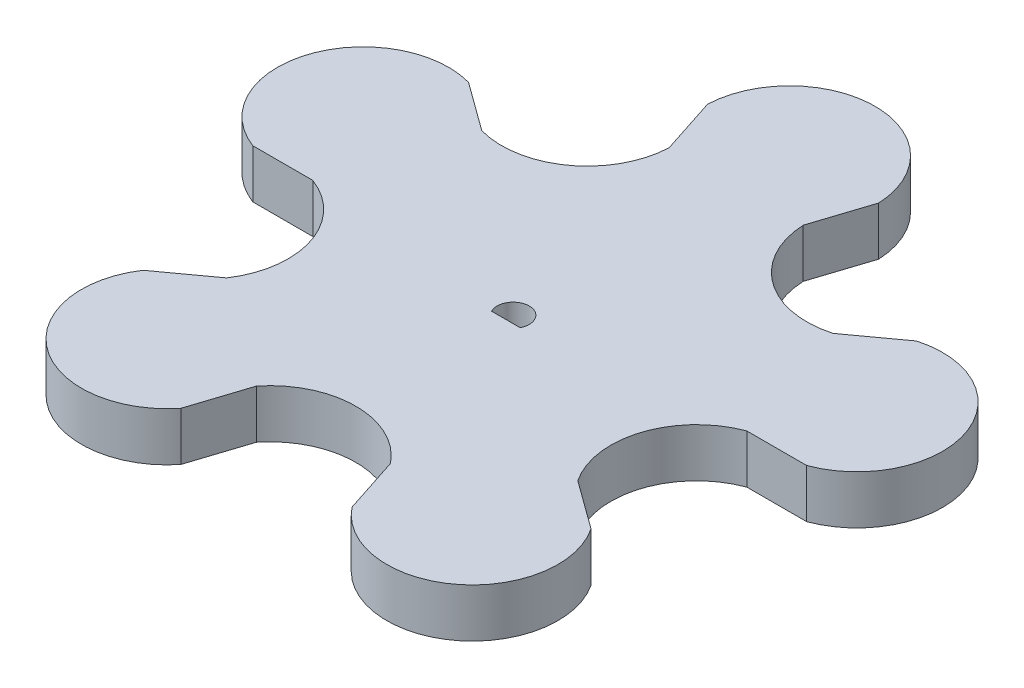
ISO-10303-21;
HEADER;
FILE_DESCRIPTION(('STEP AP214'),'2;1');
FILE_NAME('part.step','',(''),(''),'','','');
FILE_SCHEMA(('AUTOMOTIVE_DESIGN { 1 0 10303 214 1 1 1 1 }'));
ENDSEC;
DATA;
#1=APPLICATION_CONTEXT('core data for automotive mechanical design processes');
#2=APPLICATION_PROTOCOL_DEFINITION('international standard','automotive_design',2000,#1);
#3=PRODUCT_CONTEXT('',#1,'mechanical');
#4=PRODUCT('Part','Part','',(#3));
#5=PRODUCT_RELATED_PRODUCT_CATEGORY('part','',(#4));
#6=PRODUCT_DEFINITION_FORMATION('','',#4);
#7=PRODUCT_DEFINITION_CONTEXT('part definition',#1,'design');
#8=PRODUCT_DEFINITION('design','',#6,#7);
#9=PRODUCT_DEFINITION_SHAPE('','',#8);
#10=(LENGTH_UNIT() NAMED_UNIT(*) SI_UNIT(.MILLI.,.METRE.));
#11=(NAMED_UNIT(*) PLANE_ANGLE_UNIT() SI_UNIT($,.RADIAN.));
#12=(NAMED_UNIT(*) SI_UNIT($,.STERADIAN.) SOLID_ANGLE_UNIT());
#13=UNCERTAINTY_MEASURE_WITH_UNIT(LENGTH_MEASURE(1.E-05),#10,'distance_accuracy_value','');
#14=(GEOMETRIC_REPRESENTATION_CONTEXT(3) GLOBAL_UNCERTAINTY_ASSIGNED_CONTEXT((#13)) GLOBAL_UNIT_ASSIGNED_CONTEXT((#10,
#11,#12)) REPRESENTATION_CONTEXT('',''));
#15=CARTESIAN_POINT('',(0.,0.,0.));
#16=DIRECTION('',(0.,0.,1.));
#17=DIRECTION('',(1.,0.,0.));
#18=AXIS2_PLACEMENT_3D('',#15,#16,#17);
#19=CARTESIAN_POINT('',(9.9581401872886,3.175,-30.6480041153014));
#20=DIRECTION('',(0.,-1.,0.));
#21=DIRECTION('',(0.,0.,-1.));
#22=AXIS2_PLACEMENT_3D('',#19,#20,#21);
#23=CYLINDRICAL_SURFACE('',#22,5.58800000000008);
#24=CARTESIAN_POINT('',(9.9581401872886,0.,-30.6480041153014));
#25=DIRECTION('',(0.,1.,0.));
#26=DIRECTION('',(0.,0.,1.));
#27=AXIS2_PLACEMENT_3D('',#24,#25,#26);
#28=CIRCLE('',#27,5.58800000000008);
#29=CARTESIAN_POINT('',(4.37531265995944,0.,-30.4076277435516));
#30=VERTEX_POINT('',#29);
#31=CARTESIAN_POINT('',(11.4547172551814,0.,-25.264139232166));
#32=VERTEX_POINT('',#31);
#33=EDGE_CURVE('E197',#30,#32,#28,.T.);
#34=ORIENTED_EDGE('',*,*,#33,.F.);
#35=DIRECTION('',(0.,-1.,0.));
#36=VECTOR('',#35,1.);
#37=CARTESIAN_POINT('',(4.37531265995944,3.175,-30.4076277435516));
#38=LINE('',#37,#36);
#39=CARTESIAN_POINT('',(4.37531265995944,3.175,-30.4076277435516));
#40=VERTEX_POINT('',#39);
#41=EDGE_CURVE('E11',#40,#30,#38,.T.);
#42=ORIENTED_EDGE('',*,*,#41,.F.);
#43=CARTESIAN_POINT('',(9.9581401872886,3.175,-30.6480041153014));
#44=DIRECTION('',(0.,1.,0.));
#45=DIRECTION('',(0.,0.,1.));
#46=AXIS2_PLACEMENT_3D('',#43,#44,#45);
#47=CIRCLE('',#46,5.58800000000008);
#48=CARTESIAN_POINT('',(11.4547172551814,3.175,-25.264139232166));
#49=VERTEX_POINT('',#48);
#50=EDGE_CURVE('E199',#40,#49,#47,.T.);
#51=ORIENTED_EDGE('',*,*,#50,.T.);
#52=DIRECTION('',(0.,-1.,0.));
#53=VECTOR('',#52,1.);
#54=CARTESIAN_POINT('',(11.4547172551814,3.175,-25.264139232166));
#55=LINE('',#54,#53);
#56=EDGE_CURVE('E250',#49,#32,#55,.T.);
#57=ORIENTED_EDGE('',*,*,#56,.T.);
#58=EDGE_LOOP('',(#34,#42,#51,#57));
#59=FACE_BOUND('',#58,.T.);
#60=ADVANCED_FACE('F34',(#59),#23,.F.);
#61=CARTESIAN_POINT('',(-4.97907009364429,3.175,-1.61779794234925));
#62=DIRECTION('',(0.951056516295154,0.,0.309016994374947));
#63=DIRECTION('',(0.309016994374947,0.,-0.951056516295154));
#64=AXIS2_PLACEMENT_3D('',#61,#62,#63);
#65=PLANE('',#64);
#66=DIRECTION('',(-0.309016994374947,0.,0.951056516295154));
#67=VECTOR('',#66,1.);
#68=CARTESIAN_POINT('',(-4.97907009364429,0.,-1.61779794234925));
#69=LINE('',#68,#67);
#70=CARTESIAN_POINT('',(5.58282752732916,0.,-34.1239763717498));
#71=VERTEX_POINT('',#70);
#72=EDGE_CURVE('E253',#71,#30,#69,.T.);
#73=ORIENTED_EDGE('',*,*,#72,.F.);
#74=DIRECTION('',(0.,-1.,0.));
#75=VECTOR('',#74,1.);
#76=CARTESIAN_POINT('',(5.58282752732916,3.175,-34.1239763717498));
#77=LINE('',#76,#75);
#78=CARTESIAN_POINT('',(5.58282752732916,3.175,-34.1239763717498));
#79=VERTEX_POINT('',#78);
#80=EDGE_CURVE('E41',#79,#71,#77,.T.);
#81=ORIENTED_EDGE('',*,*,#80,.F.);
#82=DIRECTION('',(-0.309016994374947,0.,0.951056516295154));
#83=VECTOR('',#82,1.);
#84=CARTESIAN_POINT('',(-4.97907009364429,3.175,-1.61779794234925));
#85=LINE('',#84,#83);
#86=EDGE_CURVE('E202',#79,#40,#85,.T.);
#87=ORIENTED_EDGE('',*,*,#86,.T.);
#88=ORIENTED_EDGE('',*,*,#41,.T.);
#89=EDGE_LOOP('',(#73,#81,#87,#88));
#90=FACE_BOUND('',#89,.T.);
#91=ADVANCED_FACE('F352',(#90),#65,.T.);
#92=CARTESIAN_POINT('',(0.,3.175,-33.8836000000023));
#93=DIRECTION('',(0.,-1.,0.));
#94=DIRECTION('',(0.,0.,-1.));
#95=AXIS2_PLACEMENT_3D('',#92,#93,#94);
#96=CYLINDRICAL_SURFACE('',#95,5.58799999999983);
#97=CARTESIAN_POINT('',(0.,0.,-33.8836000000023));
#98=DIRECTION('',(0.,1.,0.));
#99=DIRECTION('',(0.,0.,1.));
#100=AXIS2_PLACEMENT_3D('',#97,#98,#99);
#101=CIRCLE('',#100,5.58799999999983);
#102=CARTESIAN_POINT('',(-5.58282752732906,0.,-34.1239763717498));
#103=VERTEX_POINT('',#102);
#104=EDGE_CURVE('E256',#71,#103,#101,.T.);
#105=ORIENTED_EDGE('',*,*,#104,.T.);
#106=DIRECTION('',(0.,-1.,0.));
#107=VECTOR('',#106,1.);
#108=CARTESIAN_POINT('',(-5.58282752732906,3.175,-34.1239763717498));
#109=LINE('',#108,#107);
#110=CARTESIAN_POINT('',(-5.58282752732906,3.175,-34.1239763717498));
#111=VERTEX_POINT('',#110);
#112=EDGE_CURVE('E341',#111,#103,#109,.T.);
#113=ORIENTED_EDGE('',*,*,#112,.F.);
#114=CARTESIAN_POINT('',(0.,3.175,-33.8836000000023));
#115=DIRECTION('',(0.,1.,0.));
#116=DIRECTION('',(0.,0.,1.));
#117=AXIS2_PLACEMENT_3D('',#114,#115,#116);
#118=CIRCLE('',#117,5.58799999999983);
#119=EDGE_CURVE('E206',#79,#111,#118,.T.);
#120=ORIENTED_EDGE('',*,*,#119,.F.);
#121=ORIENTED_EDGE('',*,*,#80,.T.);
#122=EDGE_LOOP('',(#105,#113,#120,#121));
#123=FACE_BOUND('',#122,.T.);
#124=ADVANCED_FACE('F346',(#123),#96,.T.);
#125=CARTESIAN_POINT('',(4.97907009364423,3.175,-1.6177979423492));
#126=DIRECTION('',(0.951056516295155,0.,-0.309016994374941));
#127=DIRECTION('',(-0.309016994374942,0.,-0.951056516295156));
#128=AXIS2_PLACEMENT_3D('',#125,#126,#127);
#129=PLANE('',#128);
#130=DIRECTION('',(0.309016994374942,0.,0.951056516295156));
#131=VECTOR('',#130,1.);
#132=CARTESIAN_POINT('',(4.97907009364423,0.,-1.6177979423492));
#133=LINE('',#132,#131);
#134=CARTESIAN_POINT('',(-4.37531265995936,0.,-30.4076277435517));
#135=VERTEX_POINT('',#134);
#136=EDGE_CURVE('E258',#103,#135,#133,.T.);
#137=ORIENTED_EDGE('',*,*,#136,.T.);
#138=DIRECTION('',(0.,-1.,0.));
#139=VECTOR('',#138,1.);
#140=CARTESIAN_POINT('',(-4.37531265995936,3.175,-30.4076277435517));
#141=LINE('',#140,#139);
#142=CARTESIAN_POINT('',(-4.37531265995936,3.175,-30.4076277435517));
#143=VERTEX_POINT('',#142);
#144=EDGE_CURVE('E339',#143,#135,#141,.T.);
#145=ORIENTED_EDGE('',*,*,#144,.F.);
#146=DIRECTION('',(0.309016994374942,0.,0.951056516295156));
#147=VECTOR('',#146,1.);
#148=CARTESIAN_POINT('',(4.97907009364423,3.175,-1.6177979423492));
#149=LINE('',#148,#147);
#150=EDGE_CURVE('E208',#111,#143,#149,.T.);
#151=ORIENTED_EDGE('',*,*,#150,.F.);
#152=ORIENTED_EDGE('',*,*,#112,.T.);
#153=EDGE_LOOP('',(#137,#145,#151,#152));
#154=FACE_BOUND('',#153,.T.);
#155=ADVANCED_FACE('F431',(#154),#129,.F.);
#156=CARTESIAN_POINT('',(-9.95814018728854,3.175,-30.6480041153015));
#157=DIRECTION('',(0.,-1.,0.));
#158=DIRECTION('',(0.,0.,-1.));
#159=AXIS2_PLACEMENT_3D('',#156,#157,#158);
#160=CYLINDRICAL_SURFACE('',#159,5.58800000000005);
#161=CARTESIAN_POINT('',(-9.95814018728854,0.,-30.6480041153015));
#162=DIRECTION('',(0.,1.,0.));
#163=DIRECTION('',(0.,0.,1.));
#164=AXIS2_PLACEMENT_3D('',#161,#162,#163);
#165=CIRCLE('',#164,5.58800000000005);
#166=CARTESIAN_POINT('',(-11.4547172551815,0.,-25.2641392321662));
#167=VERTEX_POINT('',#166);
#168=EDGE_CURVE('E261',#167,#135,#165,.T.);
#169=ORIENTED_EDGE('',*,*,#168,.F.);
#170=DIRECTION('',(0.,-1.,0.));
#171=VECTOR('',#170,1.);
#172=CARTESIAN_POINT('',(-11.4547172551815,3.175,-25.2641392321662));
#173=LINE('',#172,#171);
#174=CARTESIAN_POINT('',(-11.4547172551815,3.175,-25.2641392321662));
#175=VERTEX_POINT('',#174);
#176=EDGE_CURVE('E337',#175,#167,#173,.T.);
#177=ORIENTED_EDGE('',*,*,#176,.F.);
#178=CARTESIAN_POINT('',(-9.95814018728854,3.175,-30.6480041153015));
#179=DIRECTION('',(0.,1.,0.));
#180=DIRECTION('',(0.,0.,1.));
#181=AXIS2_PLACEMENT_3D('',#178,#179,#180);
#182=CIRCLE('',#181,5.58800000000005);
#183=EDGE_CURVE('E210',#175,#143,#182,.T.);
#184=ORIENTED_EDGE('',*,*,#183,.T.);
#185=ORIENTED_EDGE('',*,*,#144,.T.);
#186=EDGE_LOOP('',(#169,#177,#184,#185));
#187=FACE_BOUND('',#186,.T.);
#188=ADVANCED_FACE('F427',(#187),#160,.F.);
#189=CARTESIAN_POINT('',(8.0563046438846,3.175,-11.0885520576507));
#190=DIRECTION('',(0.587785252292473,0.,-0.809016994374947));
#191=DIRECTION('',(-0.809016994374948,0.,-0.587785252292473));
#192=AXIS2_PLACEMENT_3D('',#189,#190,#191);
#193=PLANE('',#192);
#194=DIRECTION('',(0.809016994374948,0.,0.587785252292473));
#195=VECTOR('',#194,1.);
#196=CARTESIAN_POINT('',(8.0563046438846,0.,-11.0885520576507));
#197=LINE('',#196,#195);
#198=CARTESIAN_POINT('',(-14.6160322198763,0.,-27.5609689984367));
#199=VERTEX_POINT('',#198);
#200=EDGE_CURVE('E264',#199,#167,#197,.T.);
#201=ORIENTED_EDGE('',*,*,#200,.F.);
#202=DIRECTION('',(0.,-1.,0.));
#203=VECTOR('',#202,1.);
#204=CARTESIAN_POINT('',(-14.6160322198763,3.175,-27.5609689984367));
#205=LINE('',#204,#203);
#206=CARTESIAN_POINT('',(-14.6160322198763,3.175,-27.5609689984367));
#207=VERTEX_POINT('',#206);
#208=EDGE_CURVE('E335',#207,#199,#205,.T.);
#209=ORIENTED_EDGE('',*,*,#208,.F.);
#210=DIRECTION('',(0.809016994374948,0.,0.587785252292473));
#211=VECTOR('',#210,1.);
#212=CARTESIAN_POINT('',(8.0563046438846,3.175,-11.0885520576507));
#213=LINE('',#212,#211);
#214=EDGE_CURVE('E213',#207,#175,#213,.T.);
#215=ORIENTED_EDGE('',*,*,#214,.T.);
#216=ORIENTED_EDGE('',*,*,#176,.T.);
#217=EDGE_LOOP('',(#201,#209,#215,#216));
#218=FACE_BOUND('',#217,.T.);
#219=ADVANCED_FACE('F423',(#218),#193,.T.);
#220=CARTESIAN_POINT('',(-16.1126092877692,3.175,-22.1771041153015));
#221=DIRECTION('',(0.,-1.,0.));
#222=DIRECTION('',(0.,0.,-1.));
#223=AXIS2_PLACEMENT_3D('',#220,#221,#222);
#224=CYLINDRICAL_SURFACE('',#223,5.58799999999998);
#225=CARTESIAN_POINT('',(-16.1126092877692,0.,-22.1771041153015));
#226=DIRECTION('',(0.,1.,0.));
#227=DIRECTION('',(0.,0.,1.));
#228=AXIS2_PLACEMENT_3D('',#225,#226,#227);
#229=CIRCLE('',#228,5.58799999999998);
#230=CARTESIAN_POINT('',(-18.0664093850942,0.,-16.9418));
#231=VERTEX_POINT('',#230);
#232=EDGE_CURVE('E267',#199,#231,#229,.T.);
#233=ORIENTED_EDGE('',*,*,#232,.T.);
#234=DIRECTION('',(0.,-1.,0.));
#235=VECTOR('',#234,1.);
#236=CARTESIAN_POINT('',(-18.0664093850942,3.175,-16.9418));
#237=LINE('',#236,#235);
#238=CARTESIAN_POINT('',(-18.0664093850942,3.175,-16.9418));
#239=VERTEX_POINT('',#238);
#240=EDGE_CURVE('E332',#239,#231,#237,.T.);
#241=ORIENTED_EDGE('',*,*,#240,.F.);
#242=CARTESIAN_POINT('',(-16.1126092877692,3.175,-22.1771041153015));
#243=DIRECTION('',(0.,1.,0.));
#244=DIRECTION('',(0.,0.,1.));
#245=AXIS2_PLACEMENT_3D('',#242,#243,#244);
#246=CIRCLE('',#245,5.58799999999998);
#247=EDGE_CURVE('E216',#207,#239,#246,.T.);
#248=ORIENTED_EDGE('',*,*,#247,.F.);
#249=ORIENTED_EDGE('',*,*,#208,.T.);
#250=EDGE_LOOP('',(#233,#241,#248,#249));
#251=FACE_BOUND('',#250,.T.);
#252=ADVANCED_FACE('F419',(#251),#224,.T.);
#253=CARTESIAN_POINT('',(0.,3.175,-16.9418));
#254=DIRECTION('',(0.,0.,-1.));
#255=DIRECTION('',(-1.,0.,0.));
#256=AXIS2_PLACEMENT_3D('',#253,#254,#255);
#257=PLANE('',#256);
#258=DIRECTION('',(1.,0.,0.));
#259=VECTOR('',#258,1.);
#260=CARTESIAN_POINT('',(0.,0.,-16.9418));
#261=LINE('',#260,#259);
#262=CARTESIAN_POINT('',(-14.1588091904442,0.,-16.9418));
#263=VERTEX_POINT('',#262);
#264=EDGE_CURVE('E269',#231,#263,#261,.T.);
#265=ORIENTED_EDGE('',*,*,#264,.T.);
#266=DIRECTION('',(0.,-1.,0.));
#267=VECTOR('',#266,1.);
#268=CARTESIAN_POINT('',(-14.1588091904442,3.175,-16.9418));
#269=LINE('',#268,#267);
#270=CARTESIAN_POINT('',(-14.1588091904442,3.175,-16.9418));
#271=VERTEX_POINT('',#270);
#272=EDGE_CURVE('E330',#271,#263,#269,.T.);
#273=ORIENTED_EDGE('',*,*,#272,.F.);
#274=DIRECTION('',(1.,0.,0.));
#275=VECTOR('',#274,1.);
#276=CARTESIAN_POINT('',(0.,3.175,-16.9418));
#277=LINE('',#276,#275);
#278=EDGE_CURVE('E218',#239,#271,#277,.T.);
#279=ORIENTED_EDGE('',*,*,#278,.F.);
#280=ORIENTED_EDGE('',*,*,#240,.T.);
#281=EDGE_LOOP('',(#265,#273,#279,#280));
#282=FACE_BOUND('',#281,.T.);
#283=ADVANCED_FACE('F415',(#282),#257,.F.);
#284=CARTESIAN_POINT('',(-16.1126092877692,3.175,-11.7064958846985));
#285=DIRECTION('',(0.,-1.,0.));
#286=DIRECTION('',(0.,0.,-1.));
#287=AXIS2_PLACEMENT_3D('',#284,#285,#286);
#288=CYLINDRICAL_SURFACE('',#287,5.58799999999999);
#289=CARTESIAN_POINT('',(-16.1126092877692,0.,-11.7064958846985));
#290=DIRECTION('',(0.,1.,0.));
#291=DIRECTION('',(0.,0.,1.));
#292=AXIS2_PLACEMENT_3D('',#289,#290,#291);
#293=CIRCLE('',#292,5.58799999999999);
#294=CARTESIAN_POINT('',(-11.4547172551815,0.,-8.61946076783375));
#295=VERTEX_POINT('',#294);
#296=EDGE_CURVE('E272',#295,#263,#293,.T.);
#297=ORIENTED_EDGE('',*,*,#296,.F.);
#298=DIRECTION('',(0.,-1.,0.));
#299=VECTOR('',#298,1.);
#300=CARTESIAN_POINT('',(-11.4547172551815,3.175,-8.61946076783375));
#301=LINE('',#300,#299);
#302=CARTESIAN_POINT('',(-11.4547172551815,3.175,-8.61946076783375));
#303=VERTEX_POINT('',#302);
#304=EDGE_CURVE('E328',#303,#295,#301,.T.);
#305=ORIENTED_EDGE('',*,*,#304,.F.);
#306=CARTESIAN_POINT('',(-16.1126092877692,3.175,-11.7064958846985));
#307=DIRECTION('',(0.,1.,0.));
#308=DIRECTION('',(0.,0.,1.));
#309=AXIS2_PLACEMENT_3D('',#306,#307,#308);
#310=CIRCLE('',#309,5.58799999999999);
#311=EDGE_CURVE('E220',#303,#271,#310,.T.);
#312=ORIENTED_EDGE('',*,*,#311,.T.);
#313=ORIENTED_EDGE('',*,*,#272,.T.);
#314=EDGE_LOOP('',(#297,#305,#312,#313));
#315=FACE_BOUND('',#314,.T.);
#316=ADVANCED_FACE('F410',(#315),#288,.F.);
#317=CARTESIAN_POINT('',(-8.05630464388455,3.175,-11.0885520576507));
#318=DIRECTION('',(-0.587785252292471,0.,-0.809016994374949));
#319=DIRECTION('',(-0.809016994374949,0.,0.587785252292471));
#320=AXIS2_PLACEMENT_3D('',#317,#318,#319);
#321=PLANE('',#320);
#322=DIRECTION('',(0.809016994374949,0.,-0.587785252292471));
#323=VECTOR('',#322,1.);
#324=CARTESIAN_POINT('',(-8.05630464388455,0.,-11.0885520576507));
#325=LINE('',#324,#323);
#326=CARTESIAN_POINT('',(-14.6160322198763,0.,-6.32263100156325));
#327=VERTEX_POINT('',#326);
#328=EDGE_CURVE('E275',#327,#295,#325,.T.);
#329=ORIENTED_EDGE('',*,*,#328,.F.);
#330=DIRECTION('',(0.,-1.,0.));
#331=VECTOR('',#330,1.);
#332=CARTESIAN_POINT('',(-14.6160322198763,3.175,-6.32263100156325));
#333=LINE('',#332,#331);
#334=CARTESIAN_POINT('',(-14.6160322198763,3.175,-6.32263100156325));
#335=VERTEX_POINT('',#334);
#336=EDGE_CURVE('E326',#335,#327,#333,.T.);
#337=ORIENTED_EDGE('',*,*,#336,.F.);
#338=DIRECTION('',(0.809016994374949,0.,-0.587785252292471));
#339=VECTOR('',#338,1.);
#340=CARTESIAN_POINT('',(-8.05630464388455,3.175,-11.0885520576507));
#341=LINE('',#340,#339);
#342=EDGE_CURVE('E223',#335,#303,#341,.T.);
#343=ORIENTED_EDGE('',*,*,#342,.T.);
#344=ORIENTED_EDGE('',*,*,#304,.T.);
#345=EDGE_LOOP('',(#329,#337,#343,#344));
#346=FACE_BOUND('',#345,.T.);
#347=ADVANCED_FACE('F405',(#346),#321,.T.);
#348=CARTESIAN_POINT('',(-9.9581401872886,3.175,-3.23559588469851));
#349=DIRECTION('',(0.,-1.,0.));
#350=DIRECTION('',(0.,0.,-1.));
#351=AXIS2_PLACEMENT_3D('',#348,#349,#350);
#352=CYLINDRICAL_SURFACE('',#351,5.588);
#353=CARTESIAN_POINT('',(-9.9581401872886,0.,-3.23559588469851));
#354=DIRECTION('',(0.,1.,0.));
#355=DIRECTION('',(0.,0.,1.));
#356=AXIS2_PLACEMENT_3D('',#353,#354,#355);
#357=CIRCLE('',#356,5.588);
#358=CARTESIAN_POINT('',(-5.58282752732916,0.,0.240376371749838));
#359=VERTEX_POINT('',#358);
#360=EDGE_CURVE('E278',#327,#359,#357,.T.);
#361=ORIENTED_EDGE('',*,*,#360,.T.);
#362=DIRECTION('',(0.,-1.,0.));
#363=VECTOR('',#362,1.);
#364=CARTESIAN_POINT('',(-5.58282752732916,3.175,0.240376371749838));
#365=LINE('',#364,#363);
#366=CARTESIAN_POINT('',(-5.58282752732916,3.175,0.240376371749838));
#367=VERTEX_POINT('',#366);
#368=EDGE_CURVE('E323',#367,#359,#365,.T.);
#369=ORIENTED_EDGE('',*,*,#368,.F.);
#370=CARTESIAN_POINT('',(-9.9581401872886,3.175,-3.23559588469851));
#371=DIRECTION('',(0.,1.,0.));
#372=DIRECTION('',(0.,0.,1.));
#373=AXIS2_PLACEMENT_3D('',#370,#371,#372);
#374=CIRCLE('',#373,5.588);
#375=EDGE_CURVE('E226',#335,#367,#374,.T.);
#376=ORIENTED_EDGE('',*,*,#375,.F.);
#377=ORIENTED_EDGE('',*,*,#336,.T.);
#378=EDGE_LOOP('',(#361,#369,#376,#377));
#379=FACE_BOUND('',#378,.T.);
#380=ADVANCED_FACE('F402',(#379),#352,.T.);
#381=CARTESIAN_POINT('',(-4.9790700936443,3.175,-1.61779794234925));
#382=DIRECTION('',(-0.951056516295154,0.,-0.309016994374947));
#383=DIRECTION('',(-0.309016994374947,0.,0.951056516295154));
#384=AXIS2_PLACEMENT_3D('',#381,#382,#383);
#385=PLANE('',#384);
#386=DIRECTION('',(0.309016994374947,0.,-0.951056516295154));
#387=VECTOR('',#386,1.);
#388=CARTESIAN_POINT('',(-4.9790700936443,0.,-1.61779794234925));
#389=LINE('',#388,#387);
#390=CARTESIAN_POINT('',(-4.37531265995943,0.,-3.47597225644834));
#391=VERTEX_POINT('',#390);
#392=EDGE_CURVE('E280',#359,#391,#389,.T.);
#393=ORIENTED_EDGE('',*,*,#392,.T.);
#394=DIRECTION('',(0.,-1.,0.));
#395=VECTOR('',#394,1.);
#396=CARTESIAN_POINT('',(-4.37531265995943,3.175,-3.47597225644834));
#397=LINE('',#396,#395);
#398=CARTESIAN_POINT('',(-4.37531265995943,3.175,-3.47597225644834));
#399=VERTEX_POINT('',#398);
#400=EDGE_CURVE('E321',#399,#391,#397,.T.);
#401=ORIENTED_EDGE('',*,*,#400,.F.);
#402=DIRECTION('',(0.309016994374947,0.,-0.951056516295154));
#403=VECTOR('',#402,1.);
#404=CARTESIAN_POINT('',(-4.9790700936443,3.175,-1.61779794234925));
#405=LINE('',#404,#403);
#406=EDGE_CURVE('E228',#367,#399,#405,.T.);
#407=ORIENTED_EDGE('',*,*,#406,.F.);
#408=ORIENTED_EDGE('',*,*,#368,.T.);
#409=EDGE_LOOP('',(#393,#401,#407,#408));
#410=FACE_BOUND('',#409,.T.);
#411=ADVANCED_FACE('F397',(#410),#385,.F.);
#412=CARTESIAN_POINT('',(0.,3.175,0.));
#413=DIRECTION('',(0.,-1.,0.));
#414=DIRECTION('',(0.,0.,-1.));
#415=AXIS2_PLACEMENT_3D('',#412,#413,#414);
#416=CYLINDRICAL_SURFACE('',#415,5.58799999999999);
#417=CARTESIAN_POINT('',(0.,0.,0.));
#418=DIRECTION('',(0.,1.,0.));
#419=DIRECTION('',(0.,0.,1.));
#420=AXIS2_PLACEMENT_3D('',#417,#418,#419);
#421=CIRCLE('',#420,5.58799999999999);
#422=CARTESIAN_POINT('',(4.37531265995944,0.,-3.47597225644837));
#423=VERTEX_POINT('',#422);
#424=EDGE_CURVE('E283',#423,#391,#421,.T.);
#425=ORIENTED_EDGE('',*,*,#424,.F.);
#426=DIRECTION('',(0.,-1.,0.));
#427=VECTOR('',#426,1.);
#428=CARTESIAN_POINT('',(4.37531265995944,3.175,-3.47597225644837));
#429=LINE('',#428,#427);
#430=CARTESIAN_POINT('',(4.37531265995944,3.175,-3.47597225644837));
#431=VERTEX_POINT('',#430);
#432=EDGE_CURVE('E319',#431,#423,#429,.T.);
#433=ORIENTED_EDGE('',*,*,#432,.F.);
#434=CARTESIAN_POINT('',(0.,3.175,0.));
#435=DIRECTION('',(0.,1.,0.));
#436=DIRECTION('',(0.,0.,1.));
#437=AXIS2_PLACEMENT_3D('',#434,#435,#436);
#438=CIRCLE('',#437,5.58799999999999);
#439=EDGE_CURVE('E230',#431,#399,#438,.T.);
#440=ORIENTED_EDGE('',*,*,#439,.T.);
#441=ORIENTED_EDGE('',*,*,#400,.T.);
#442=EDGE_LOOP('',(#425,#433,#440,#441));
#443=FACE_BOUND('',#442,.T.);
#444=ADVANCED_FACE('F391',(#443),#416,.F.);
#445=CARTESIAN_POINT('',(4.97907009364431,3.175,-1.61779794234926));
#446=DIRECTION('',(-0.951056516295154,0.,0.309016994374948));
#447=DIRECTION('',(0.309016994374948,0.,0.951056516295154));
#448=AXIS2_PLACEMENT_3D('',#445,#446,#447);
#449=PLANE('',#448);
#450=DIRECTION('',(-0.309016994374948,0.,-0.951056516295154));
#451=VECTOR('',#450,1.);
#452=CARTESIAN_POINT('',(4.97907009364431,0.,-1.61779794234926));
#453=LINE('',#452,#451);
#454=CARTESIAN_POINT('',(5.58282752732918,0.,0.240376371749849));
#455=VERTEX_POINT('',#454);
#456=EDGE_CURVE('E286',#455,#423,#453,.T.);
#457=ORIENTED_EDGE('',*,*,#456,.F.);
#458=DIRECTION('',(0.,-1.,0.));
#459=VECTOR('',#458,1.);
#460=CARTESIAN_POINT('',(5.58282752732918,3.175,0.240376371749849));
#461=LINE('',#460,#459);
#462=CARTESIAN_POINT('',(5.58282752732918,3.175,0.240376371749849));
#463=VERTEX_POINT('',#462);
#464=EDGE_CURVE('E317',#463,#455,#461,.T.);
#465=ORIENTED_EDGE('',*,*,#464,.F.);
#466=DIRECTION('',(-0.309016994374948,0.,-0.951056516295154));
#467=VECTOR('',#466,1.);
#468=CARTESIAN_POINT('',(4.97907009364431,3.175,-1.61779794234926));
#469=LINE('',#468,#467);
#470=EDGE_CURVE('E233',#463,#431,#469,.T.);
#471=ORIENTED_EDGE('',*,*,#470,.T.);
#472=ORIENTED_EDGE('',*,*,#432,.T.);
#473=EDGE_LOOP('',(#457,#465,#471,#472));
#474=FACE_BOUND('',#473,.T.);
#475=ADVANCED_FACE('F387',(#474),#449,.T.);
#476=CARTESIAN_POINT('',(9.95814018728844,3.175,-3.23559588469838));
#477=DIRECTION('',(0.,-1.,0.));
#478=DIRECTION('',(0.,0.,-1.));
#479=AXIS2_PLACEMENT_3D('',#476,#477,#478);
#480=CYLINDRICAL_SURFACE('',#479,5.588);
#481=CARTESIAN_POINT('',(9.95814018728844,0.,-3.23559588469838));
#482=DIRECTION('',(0.,1.,0.));
#483=DIRECTION('',(0.,0.,1.));
#484=AXIS2_PLACEMENT_3D('',#481,#482,#483);
#485=CIRCLE('',#484,5.588);
#486=CARTESIAN_POINT('',(14.6160322198763,0.,-6.32263100156326));
#487=VERTEX_POINT('',#486);
#488=EDGE_CURVE('E289',#455,#487,#485,.T.);
#489=ORIENTED_EDGE('',*,*,#488,.T.);
#490=DIRECTION('',(0.,-1.,0.));
#491=VECTOR('',#490,1.);
#492=CARTESIAN_POINT('',(14.6160322198763,3.175,-6.32263100156326));
#493=LINE('',#492,#491);
#494=CARTESIAN_POINT('',(14.6160322198763,3.175,-6.32263100156326));
#495=VERTEX_POINT('',#494);
#496=EDGE_CURVE('E314',#495,#487,#493,.T.);
#497=ORIENTED_EDGE('',*,*,#496,.F.);
#498=CARTESIAN_POINT('',(9.95814018728844,3.175,-3.23559588469838));
#499=DIRECTION('',(0.,1.,0.));
#500=DIRECTION('',(0.,0.,1.));
#501=AXIS2_PLACEMENT_3D('',#498,#499,#500);
#502=CIRCLE('',#501,5.588);
#503=EDGE_CURVE('E236',#463,#495,#502,.T.);
#504=ORIENTED_EDGE('',*,*,#503,.F.);
#505=ORIENTED_EDGE('',*,*,#464,.T.);
#506=EDGE_LOOP('',(#489,#497,#504,#505));
#507=FACE_BOUND('',#506,.T.);
#508=ADVANCED_FACE('F383',(#507),#480,.T.);
#509=CARTESIAN_POINT('',(8.0563046438846,3.175,-11.0885520576507));
#510=DIRECTION('',(-0.587785252292472,0.,0.809016994374948));
#511=DIRECTION('',(0.809016994374948,0.,0.587785252292472));
#512=AXIS2_PLACEMENT_3D('',#509,#510,#511);
#513=PLANE('',#512);
#514=DIRECTION('',(-0.809016994374948,0.,-0.587785252292472));
#515=VECTOR('',#514,1.);
#516=CARTESIAN_POINT('',(8.0563046438846,0.,-11.0885520576507));
#517=LINE('',#516,#515);
#518=CARTESIAN_POINT('',(11.4547172551815,0.,-8.61946076783377));
#519=VERTEX_POINT('',#518);
#520=EDGE_CURVE('E291',#487,#519,#517,.T.);
#521=ORIENTED_EDGE('',*,*,#520,.T.);
#522=DIRECTION('',(0.,-1.,0.));
#523=VECTOR('',#522,1.);
#524=CARTESIAN_POINT('',(11.4547172551815,3.175,-8.61946076783377));
#525=LINE('',#524,#523);
#526=CARTESIAN_POINT('',(11.4547172551815,3.175,-8.61946076783377));
#527=VERTEX_POINT('',#526);
#528=EDGE_CURVE('E312',#527,#519,#525,.T.);
#529=ORIENTED_EDGE('',*,*,#528,.F.);
#530=DIRECTION('',(-0.809016994374948,0.,-0.587785252292472));
#531=VECTOR('',#530,1.);
#532=CARTESIAN_POINT('',(8.0563046438846,3.175,-11.0885520576507));
#533=LINE('',#532,#531);
#534=EDGE_CURVE('E238',#495,#527,#533,.T.);
#535=ORIENTED_EDGE('',*,*,#534,.F.);
#536=ORIENTED_EDGE('',*,*,#496,.T.);
#537=EDGE_LOOP('',(#521,#529,#535,#536));
#538=FACE_BOUND('',#537,.T.);
#539=ADVANCED_FACE('F379',(#538),#513,.F.);
#540=CARTESIAN_POINT('',(16.1126092877692,3.175,-11.7064958846985));
#541=DIRECTION('',(0.,-1.,0.));
#542=DIRECTION('',(0.,0.,-1.));
#543=AXIS2_PLACEMENT_3D('',#540,#541,#542);
#544=CYLINDRICAL_SURFACE('',#543,5.58799999999998);
#545=CARTESIAN_POINT('',(16.1126092877692,0.,-11.7064958846985));
#546=DIRECTION('',(0.,1.,0.));
#547=DIRECTION('',(0.,0.,1.));
#548=AXIS2_PLACEMENT_3D('',#545,#546,#547);
#549=CIRCLE('',#548,5.58799999999998);
#550=CARTESIAN_POINT('',(14.1588091904442,0.,-16.9418));
#551=VERTEX_POINT('',#550);
#552=EDGE_CURVE('E294',#551,#519,#549,.T.);
#553=ORIENTED_EDGE('',*,*,#552,.F.);
#554=DIRECTION('',(0.,-1.,0.));
#555=VECTOR('',#554,1.);
#556=CARTESIAN_POINT('',(14.1588091904442,3.175,-16.9418));
#557=LINE('',#556,#555);
#558=CARTESIAN_POINT('',(14.1588091904442,3.175,-16.9418));
#559=VERTEX_POINT('',#558);
#560=EDGE_CURVE('E310',#559,#551,#557,.T.);
#561=ORIENTED_EDGE('',*,*,#560,.F.);
#562=CARTESIAN_POINT('',(16.1126092877692,3.175,-11.7064958846985));
#563=DIRECTION('',(0.,1.,0.));
#564=DIRECTION('',(0.,0.,1.));
#565=AXIS2_PLACEMENT_3D('',#562,#563,#564);
#566=CIRCLE('',#565,5.58799999999998);
#567=EDGE_CURVE('E240',#559,#527,#566,.T.);
#568=ORIENTED_EDGE('',*,*,#567,.T.);
#569=ORIENTED_EDGE('',*,*,#528,.T.);
#570=EDGE_LOOP('',(#553,#561,#568,#569));
#571=FACE_BOUND('',#570,.T.);
#572=ADVANCED_FACE('F374',(#571),#544,.F.);
#573=CARTESIAN_POINT('',(0.,3.175,-16.9418));
#574=DIRECTION('',(0.,0.,1.));
#575=DIRECTION('',(1.,0.,0.));
#576=AXIS2_PLACEMENT_3D('',#573,#574,#575);
#577=PLANE('',#576);
#578=DIRECTION('',(-1.,0.,0.));
#579=VECTOR('',#578,1.);
#580=CARTESIAN_POINT('',(0.,0.,-16.9418));
#581=LINE('',#580,#579);
#582=CARTESIAN_POINT('',(18.0664093850942,0.,-16.9418));
#583=VERTEX_POINT('',#582);
#584=EDGE_CURVE('E297',#583,#551,#581,.T.);
#585=ORIENTED_EDGE('',*,*,#584,.F.);
#586=DIRECTION('',(0.,-1.,0.));
#587=VECTOR('',#586,1.);
#588=CARTESIAN_POINT('',(18.0664093850942,3.175,-16.9418));
#589=LINE('',#588,#587);
#590=CARTESIAN_POINT('',(18.0664093850942,3.175,-16.9418));
#591=VERTEX_POINT('',#590);
#592=EDGE_CURVE('E308',#591,#583,#589,.T.);
#593=ORIENTED_EDGE('',*,*,#592,.F.);
#594=DIRECTION('',(-1.,0.,0.));
#595=VECTOR('',#594,1.);
#596=CARTESIAN_POINT('',(0.,3.175,-16.9418));
#597=LINE('',#596,#595);
#598=EDGE_CURVE('E243',#591,#559,#597,.T.);
#599=ORIENTED_EDGE('',*,*,#598,.T.);
#600=ORIENTED_EDGE('',*,*,#560,.T.);
#601=EDGE_LOOP('',(#585,#593,#599,#600));
#602=FACE_BOUND('',#601,.T.);
#603=ADVANCED_FACE('F369',(#602),#577,.T.);
#604=CARTESIAN_POINT('',(16.1126092877692,3.175,-22.1771041153015));
#605=DIRECTION('',(0.,-1.,0.));
#606=DIRECTION('',(0.,0.,-1.));
#607=AXIS2_PLACEMENT_3D('',#604,#605,#606);
#608=CYLINDRICAL_SURFACE('',#607,5.588);
#609=CARTESIAN_POINT('',(16.1126092877692,0.,-22.1771041153015));
#610=DIRECTION('',(0.,1.,0.));
#611=DIRECTION('',(0.,0.,1.));
#612=AXIS2_PLACEMENT_3D('',#609,#610,#611);
#613=CIRCLE('',#612,5.588);
#614=CARTESIAN_POINT('',(14.6160322198766,0.,-27.5609689984368));
#615=VERTEX_POINT('',#614);
#616=EDGE_CURVE('E300',#583,#615,#613,.T.);
#617=ORIENTED_EDGE('',*,*,#616,.T.);
#618=DIRECTION('',(0.,-1.,0.));
#619=VECTOR('',#618,1.);
#620=CARTESIAN_POINT('',(14.6160322198766,3.175,-27.5609689984368));
#621=LINE('',#620,#619);
#622=CARTESIAN_POINT('',(14.6160322198766,3.175,-27.5609689984368));
#623=VERTEX_POINT('',#622);
#624=EDGE_CURVE('E305',#623,#615,#621,.T.);
#625=ORIENTED_EDGE('',*,*,#624,.F.);
#626=CARTESIAN_POINT('',(16.1126092877692,3.175,-22.1771041153015));
#627=DIRECTION('',(0.,1.,0.));
#628=DIRECTION('',(0.,0.,1.));
#629=AXIS2_PLACEMENT_3D('',#626,#627,#628);
#630=CIRCLE('',#629,5.588);
#631=EDGE_CURVE('E246',#591,#623,#630,.T.);
#632=ORIENTED_EDGE('',*,*,#631,.F.);
#633=ORIENTED_EDGE('',*,*,#592,.T.);
#634=EDGE_LOOP('',(#617,#625,#632,#633));
#635=FACE_BOUND('',#634,.T.);
#636=ADVANCED_FACE('F366',(#635),#608,.T.);
#637=CARTESIAN_POINT('',(-8.05630464388456,3.175,-11.0885520576507));
#638=DIRECTION('',(0.587785252292471,0.,0.809016994374949));
#639=DIRECTION('',(0.809016994374949,0.,-0.587785252292471));
#640=AXIS2_PLACEMENT_3D('',#637,#638,#639);
#641=PLANE('',#640);
#642=DIRECTION('',(-0.809016994374949,0.,0.587785252292471));
#643=VECTOR('',#642,1.);
#644=CARTESIAN_POINT('',(-8.05630464388456,0.,-11.0885520576507));
#645=LINE('',#644,#643);
#646=EDGE_CURVE('E203',#615,#32,#645,.T.);
#647=ORIENTED_EDGE('',*,*,#646,.T.);
#648=ORIENTED_EDGE('',*,*,#56,.F.);
#649=DIRECTION('',(-0.809016994374949,0.,0.587785252292471));
#650=VECTOR('',#649,1.);
#651=CARTESIAN_POINT('',(-8.05630464388456,3.175,-11.0885520576507));
#652=LINE('',#651,#650);
#653=EDGE_CURVE('E248',#623,#49,#652,.T.);
#654=ORIENTED_EDGE('',*,*,#653,.F.);
#655=ORIENTED_EDGE('',*,*,#624,.T.);
#656=EDGE_LOOP('',(#647,#648,#654,#655));
#657=FACE_BOUND('',#656,.T.);
#658=ADVANCED_FACE('F361',(#657),#641,.F.);
#659=CARTESIAN_POINT('',(0.,3.175,0.));
#660=DIRECTION('',(0.,1.,0.));
#661=DIRECTION('',(0.,0.,1.));
#662=AXIS2_PLACEMENT_3D('',#659,#660,#661);
#663=PLANE('',#662);
#664=CARTESIAN_POINT('',(0.,3.175,-15.8576085753671));
#665=DIRECTION('',(0.,1.,0.));
#666=DIRECTION('',(0.,0.,1.));
#667=AXIS2_PLACEMENT_3D('',#664,#665,#666);
#668=CIRCLE('',#667,1.04775);
#669=CARTESIAN_POINT('',(0.933255592000375,3.175,-15.3813585753671));
#670=VERTEX_POINT('',#669);
#671=CARTESIAN_POINT('',(-0.933255592000409,3.175,-15.3813585753671));
#672=VERTEX_POINT('',#671);
#673=EDGE_CURVE('E48',#670,#672,#668,.T.);
#674=ORIENTED_EDGE('',*,*,#673,.F.);
#675=DIRECTION('',(1.,0.,0.));
#676=VECTOR('',#675,1.);
#677=CARTESIAN_POINT('',(-0.933255592000409,3.175,-15.3813585753671));
#678=LINE('',#677,#676);
#679=EDGE_CURVE('E192',#672,#670,#678,.T.);
#680=ORIENTED_EDGE('',*,*,#679,.F.);
#681=EDGE_LOOP('',(#674,#680));
#682=FACE_BOUND('',#681,.T.);
#683=ORIENTED_EDGE('',*,*,#50,.F.);
#684=ORIENTED_EDGE('',*,*,#86,.F.);
#685=ORIENTED_EDGE('',*,*,#119,.T.);
#686=ORIENTED_EDGE('',*,*,#150,.T.);
#687=ORIENTED_EDGE('',*,*,#183,.F.);
#688=ORIENTED_EDGE('',*,*,#214,.F.);
#689=ORIENTED_EDGE('',*,*,#247,.T.);
#690=ORIENTED_EDGE('',*,*,#278,.T.);
#691=ORIENTED_EDGE('',*,*,#311,.F.);
#692=ORIENTED_EDGE('',*,*,#342,.F.);
#693=ORIENTED_EDGE('',*,*,#375,.T.);
#694=ORIENTED_EDGE('',*,*,#406,.T.);
#695=ORIENTED_EDGE('',*,*,#439,.F.);
#696=ORIENTED_EDGE('',*,*,#470,.F.);
#697=ORIENTED_EDGE('',*,*,#503,.T.);
#698=ORIENTED_EDGE('',*,*,#534,.T.);
#699=ORIENTED_EDGE('',*,*,#567,.F.);
#700=ORIENTED_EDGE('',*,*,#598,.F.);
#701=ORIENTED_EDGE('',*,*,#631,.T.);
#702=ORIENTED_EDGE('',*,*,#653,.T.);
#703=EDGE_LOOP('',(#683,#684,#685,#686,#687,#688,#689,#690,#691,#692,#693,#694,#695,#696,#697,
#698,#699,#700,#701,#702));
#704=FACE_BOUND('',#703,.T.);
#705=ADVANCED_FACE('F433',(#682,#704),#663,.T.);
#706=CARTESIAN_POINT('',(0.,0.,0.));
#707=DIRECTION('',(0.,1.,0.));
#708=DIRECTION('',(0.,0.,1.));
#709=AXIS2_PLACEMENT_3D('',#706,#707,#708);
#710=PLANE('',#709);
#711=DIRECTION('',(1.,0.,0.));
#712=VECTOR('',#711,1.);
#713=CARTESIAN_POINT('',(-0.933255592000409,0.,-15.3813585753671));
#714=LINE('',#713,#712);
#715=CARTESIAN_POINT('',(-0.933255592000409,0.,-15.3813585753671));
#716=VERTEX_POINT('',#715);
#717=CARTESIAN_POINT('',(0.933255592000375,0.,-15.3813585753671));
#718=VERTEX_POINT('',#717);
#719=EDGE_CURVE('E184',#716,#718,#714,.T.);
#720=ORIENTED_EDGE('',*,*,#719,.T.);
#721=CARTESIAN_POINT('',(0.,0.,-15.8576085753671));
#722=DIRECTION('',(0.,1.,0.));
#723=DIRECTION('',(0.,0.,1.));
#724=AXIS2_PLACEMENT_3D('',#721,#722,#723);
#725=CIRCLE('',#724,1.04775);
#726=EDGE_CURVE('E53',#718,#716,#725,.T.);
#727=ORIENTED_EDGE('',*,*,#726,.T.);
#728=EDGE_LOOP('',(#720,#727));
#729=FACE_BOUND('',#728,.T.);
#730=ORIENTED_EDGE('',*,*,#33,.T.);
#731=ORIENTED_EDGE('',*,*,#646,.F.);
#732=ORIENTED_EDGE('',*,*,#616,.F.);
#733=ORIENTED_EDGE('',*,*,#584,.T.);
#734=ORIENTED_EDGE('',*,*,#552,.T.);
#735=ORIENTED_EDGE('',*,*,#520,.F.);
#736=ORIENTED_EDGE('',*,*,#488,.F.);
#737=ORIENTED_EDGE('',*,*,#456,.T.);
#738=ORIENTED_EDGE('',*,*,#424,.T.);
#739=ORIENTED_EDGE('',*,*,#392,.F.);
#740=ORIENTED_EDGE('',*,*,#360,.F.);
#741=ORIENTED_EDGE('',*,*,#328,.T.);
#742=ORIENTED_EDGE('',*,*,#296,.T.);
#743=ORIENTED_EDGE('',*,*,#264,.F.);
#744=ORIENTED_EDGE('',*,*,#232,.F.);
#745=ORIENTED_EDGE('',*,*,#200,.T.);
#746=ORIENTED_EDGE('',*,*,#168,.T.);
#747=ORIENTED_EDGE('',*,*,#136,.F.);
#748=ORIENTED_EDGE('',*,*,#104,.F.);
#749=ORIENTED_EDGE('',*,*,#72,.T.);
#750=EDGE_LOOP('',(#730,#731,#732,#733,#734,#735,#736,#737,#738,#739,#740,#741,#742,#743,#744,
#745,#746,#747,#748,#749));
#751=FACE_BOUND('',#750,.T.);
#752=ADVANCED_FACE('F190',(#729,#751),#710,.F.);
#753=CARTESIAN_POINT('',(0.,0.,-15.8576085753671));
#754=DIRECTION('',(0.,1.,0.));
#755=DIRECTION('',(0.,0.,1.));
#756=AXIS2_PLACEMENT_3D('',#753,#754,#755);
#757=CYLINDRICAL_SURFACE('',#756,1.04775);
#758=ORIENTED_EDGE('',*,*,#673,.T.);
#759=DIRECTION('',(0.,1.,0.));
#760=VECTOR('',#759,1.);
#761=CARTESIAN_POINT('',(-0.933255592000409,0.,-15.3813585753671));
#762=LINE('',#761,#760);
#763=EDGE_CURVE('E177',#716,#672,#762,.T.);
#764=ORIENTED_EDGE('',*,*,#763,.F.);
#765=ORIENTED_EDGE('',*,*,#726,.F.);
#766=DIRECTION('',(0.,1.,0.));
#767=VECTOR('',#766,1.);
#768=CARTESIAN_POINT('',(0.933255592000375,0.,-15.3813585753671));
#769=LINE('',#768,#767);
#770=EDGE_CURVE('E183',#718,#670,#769,.T.);
#771=ORIENTED_EDGE('',*,*,#770,.T.);
#772=EDGE_LOOP('',(#758,#764,#765,#771));
#773=FACE_BOUND('',#772,.T.);
#774=ADVANCED_FACE('F179',(#773),#757,.F.);
#775=CARTESIAN_POINT('',(-0.933255592000409,0.,-15.3813585753671));
#776=DIRECTION('',(0.,0.,1.));
#777=DIRECTION('',(1.,0.,0.));
#778=AXIS2_PLACEMENT_3D('',#775,#776,#777);
#779=PLANE('',#778);
#780=ORIENTED_EDGE('',*,*,#679,.T.);
#781=ORIENTED_EDGE('',*,*,#770,.F.);
#782=ORIENTED_EDGE('',*,*,#719,.F.);
#783=ORIENTED_EDGE('',*,*,#763,.T.);
#784=EDGE_LOOP('',(#780,#781,#782,#783));
#785=FACE_BOUND('',#784,.T.);
#786=ADVANCED_FACE('F187',(#785),#779,.F.);
#787=CLOSED_SHELL('',(#60,#91,#124,#155,#188,#219,#252,#283,#316,#347,#380,#411,#444,#475,#508,
#539,#572,#603,#636,#658,#705,#752,#774,#786));
#788=MANIFOLD_SOLID_BREP('B2',#787);
#789=ADVANCED_BREP_SHAPE_REPRESENTATION('',(#18,#788),#14);
#790=SHAPE_DEFINITION_REPRESENTATION(#9,#789);
ENDSEC;
END-ISO-10303-21;
